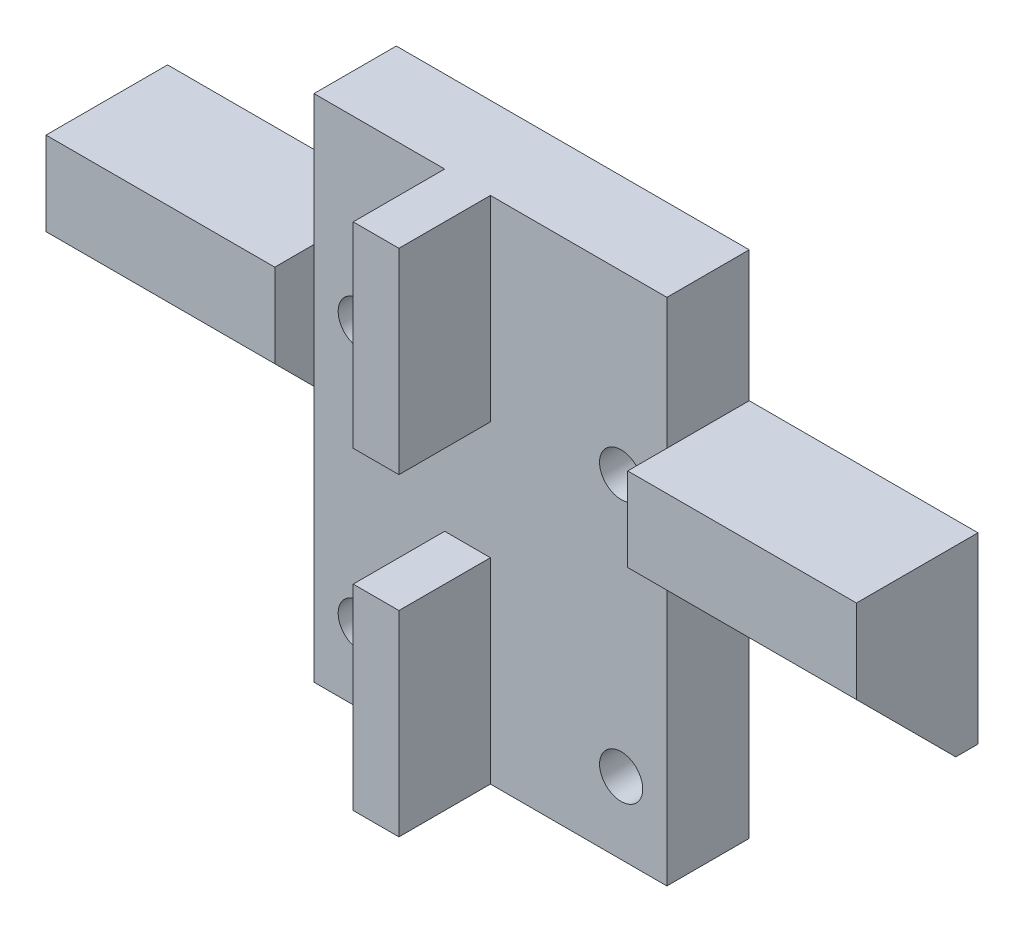
ISO-10303-21;
HEADER;
FILE_DESCRIPTION(('STEP AP214'),'2;1');
FILE_NAME('part.step','',(''),(''),'','','');
FILE_SCHEMA(('AUTOMOTIVE_DESIGN { 1 0 10303 214 1 1 1 1 }'));
ENDSEC;
DATA;
#1=APPLICATION_CONTEXT('core data for automotive mechanical design processes');
#2=APPLICATION_PROTOCOL_DEFINITION('international standard','automotive_design',2000,#1);
#3=PRODUCT_CONTEXT('',#1,'mechanical');
#4=PRODUCT('Part','Part','',(#3));
#5=PRODUCT_RELATED_PRODUCT_CATEGORY('part','',(#4));
#6=PRODUCT_DEFINITION_FORMATION('','',#4);
#7=PRODUCT_DEFINITION_CONTEXT('part definition',#1,'design');
#8=PRODUCT_DEFINITION('design','',#6,#7);
#9=PRODUCT_DEFINITION_SHAPE('','',#8);
#10=(LENGTH_UNIT() NAMED_UNIT(*) SI_UNIT(.MILLI.,.METRE.));
#11=(NAMED_UNIT(*) PLANE_ANGLE_UNIT() SI_UNIT($,.RADIAN.));
#12=(NAMED_UNIT(*) SI_UNIT($,.STERADIAN.) SOLID_ANGLE_UNIT());
#13=UNCERTAINTY_MEASURE_WITH_UNIT(LENGTH_MEASURE(1.E-05),#10,'distance_accuracy_value','');
#14=(GEOMETRIC_REPRESENTATION_CONTEXT(3) GLOBAL_UNCERTAINTY_ASSIGNED_CONTEXT((#13)) GLOBAL_UNIT_ASSIGNED_CONTEXT((#10,
#11,#12)) REPRESENTATION_CONTEXT('',''));
#15=CARTESIAN_POINT('',(0.,0.,0.));
#16=DIRECTION('',(0.,0.,1.));
#17=DIRECTION('',(1.,0.,0.));
#18=AXIS2_PLACEMENT_3D('',#15,#16,#17);
#19=CARTESIAN_POINT('',(-31.,13.5,13.3));
#20=DIRECTION('',(0.,-1.,0.));
#21=DIRECTION('',(0.,0.,-1.));
#22=AXIS2_PLACEMENT_3D('',#19,#20,#21);
#23=PLANE('',#22);
#24=DIRECTION('',(-1.,0.,0.));
#25=VECTOR('',#24,1.);
#26=CARTESIAN_POINT('',(-31.,13.5,9.3));
#27=LINE('',#26,#25);
#28=CARTESIAN_POINT('',(-13.5,13.5,9.3));
#29=VERTEX_POINT('',#28);
#30=CARTESIAN_POINT('',(-31.,13.5,9.3));
#31=VERTEX_POINT('',#30);
#32=EDGE_CURVE('E337',#29,#31,#27,.T.);
#33=ORIENTED_EDGE('',*,*,#32,.F.);
#34=DIRECTION('',(0.,0.,-1.));
#35=VECTOR('',#34,1.);
#36=CARTESIAN_POINT('',(-13.5,13.5,13.3));
#37=LINE('',#36,#35);
#38=CARTESIAN_POINT('',(-13.5,13.5,6.3));
#39=VERTEX_POINT('',#38);
#40=EDGE_CURVE('E11',#29,#39,#37,.T.);
#41=ORIENTED_EDGE('',*,*,#40,.T.);
#42=CARTESIAN_POINT('',(-13.5,13.5,0.));
#43=VERTEX_POINT('',#42);
#44=EDGE_CURVE('E43',#39,#43,#37,.T.);
#45=ORIENTED_EDGE('',*,*,#44,.T.);
#46=DIRECTION('',(-1.,0.,0.));
#47=VECTOR('',#46,1.);
#48=CARTESIAN_POINT('',(-31.,13.5,0.));
#49=LINE('',#48,#47);
#50=CARTESIAN_POINT('',(-31.,13.5,0.));
#51=VERTEX_POINT('',#50);
#52=EDGE_CURVE('E270',#43,#51,#49,.T.);
#53=ORIENTED_EDGE('',*,*,#52,.T.);
#54=DIRECTION('',(0.,0.,-1.));
#55=VECTOR('',#54,1.);
#56=CARTESIAN_POINT('',(-31.,13.5,13.3));
#57=LINE('',#56,#55);
#58=EDGE_CURVE('E218',#31,#51,#57,.T.);
#59=ORIENTED_EDGE('',*,*,#58,.F.);
#60=EDGE_LOOP('',(#33,#41,#45,#53,#59));
#61=FACE_BOUND('',#60,.T.);
#62=ADVANCED_FACE('F34',(#61),#23,.F.);
#63=CARTESIAN_POINT('',(-31.,-0.5,13.3));
#64=DIRECTION('',(1.,0.,0.));
#65=DIRECTION('',(0.,1.,0.));
#66=AXIS2_PLACEMENT_3D('',#63,#64,#65);
#67=PLANE('',#66);
#68=DIRECTION('',(0.,0.,-1.));
#69=VECTOR('',#68,1.);
#70=CARTESIAN_POINT('',(-31.,-0.5,13.3));
#71=LINE('',#70,#69);
#72=CARTESIAN_POINT('',(-31.,-0.500000000000015,1.7));
#73=VERTEX_POINT('',#72);
#74=CARTESIAN_POINT('',(-31.,-0.5,0.));
#75=VERTEX_POINT('',#74);
#76=EDGE_CURVE('E210',#73,#75,#71,.T.);
#77=ORIENTED_EDGE('',*,*,#76,.F.);
#78=DIRECTION('',(0.,-0.707106781186548,-0.707106781186547));
#79=VECTOR('',#78,1.);
#80=CARTESIAN_POINT('',(-31.,-0.500000000000015,1.7));
#81=LINE('',#80,#79);
#82=CARTESIAN_POINT('',(-31.,7.09999999999999,9.3));
#83=VERTEX_POINT('',#82);
#84=EDGE_CURVE('E195',#83,#73,#81,.T.);
#85=ORIENTED_EDGE('',*,*,#84,.F.);
#86=DIRECTION('',(0.,-1.,0.));
#87=VECTOR('',#86,1.);
#88=CARTESIAN_POINT('',(-31.,13.5,9.3));
#89=LINE('',#88,#87);
#90=EDGE_CURVE('E376',#31,#83,#89,.T.);
#91=ORIENTED_EDGE('',*,*,#90,.F.);
#92=ORIENTED_EDGE('',*,*,#58,.T.);
#93=DIRECTION('',(0.,-1.,0.));
#94=VECTOR('',#93,1.);
#95=CARTESIAN_POINT('',(-31.,-0.5,0.));
#96=LINE('',#95,#94);
#97=EDGE_CURVE('E216',#51,#75,#96,.T.);
#98=ORIENTED_EDGE('',*,*,#97,.T.);
#99=EDGE_LOOP('',(#77,#85,#91,#92,#98));
#100=FACE_BOUND('',#99,.T.);
#101=ADVANCED_FACE('F214',(#100),#67,.F.);
#102=CARTESIAN_POINT('',(-13.5,-0.500000000000006,13.3));
#103=DIRECTION('',(0.,1.,0.));
#104=DIRECTION('',(-1.,0.,0.));
#105=AXIS2_PLACEMENT_3D('',#102,#103,#104);
#106=PLANE('',#105);
#107=DIRECTION('',(0.,0.,-1.));
#108=VECTOR('',#107,1.);
#109=CARTESIAN_POINT('',(-13.5,-0.500000000000006,13.3));
#110=LINE('',#109,#108);
#111=CARTESIAN_POINT('',(-13.5,-0.500000000000011,1.7));
#112=VERTEX_POINT('',#111);
#113=CARTESIAN_POINT('',(-13.5,-0.500000000000006,0.));
#114=VERTEX_POINT('',#113);
#115=EDGE_CURVE('E212',#112,#114,#110,.T.);
#116=ORIENTED_EDGE('',*,*,#115,.F.);
#117=DIRECTION('',(-1.,0.,0.));
#118=VECTOR('',#117,1.);
#119=CARTESIAN_POINT('',(-2.75197692596447,-0.500000000000008,1.7));
#120=LINE('',#119,#118);
#121=EDGE_CURVE('E198',#112,#73,#120,.T.);
#122=ORIENTED_EDGE('',*,*,#121,.T.);
#123=ORIENTED_EDGE('',*,*,#76,.T.);
#124=DIRECTION('',(1.,0.,0.));
#125=VECTOR('',#124,1.);
#126=CARTESIAN_POINT('',(-13.5,-0.500000000000006,0.));
#127=LINE('',#126,#125);
#128=EDGE_CURVE('E267',#75,#114,#127,.T.);
#129=ORIENTED_EDGE('',*,*,#128,.T.);
#130=EDGE_LOOP('',(#116,#122,#123,#129));
#131=FACE_BOUND('',#130,.T.);
#132=ADVANCED_FACE('F208',(#131),#106,.F.);
#133=CARTESIAN_POINT('',(31.,-0.5,13.3));
#134=DIRECTION('',(0.,1.,0.));
#135=DIRECTION('',(-1.,0.,0.));
#136=AXIS2_PLACEMENT_3D('',#133,#134,#135);
#137=PLANE('',#136);
#138=DIRECTION('',(0.,0.,-1.));
#139=VECTOR('',#138,1.);
#140=CARTESIAN_POINT('',(31.,-0.5,13.3));
#141=LINE('',#140,#139);
#142=CARTESIAN_POINT('',(31.,-0.500000000000008,1.7));
#143=VERTEX_POINT('',#142);
#144=CARTESIAN_POINT('',(31.,-0.5,0.));
#145=VERTEX_POINT('',#144);
#146=EDGE_CURVE('E229',#143,#145,#141,.T.);
#147=ORIENTED_EDGE('',*,*,#146,.F.);
#148=DIRECTION('',(1.,0.,0.));
#149=VECTOR('',#148,1.);
#150=CARTESIAN_POINT('',(2.75197692596447,-0.500000000000001,1.7));
#151=LINE('',#150,#149);
#152=CARTESIAN_POINT('',(13.5,-0.500000000000004,1.7));
#153=VERTEX_POINT('',#152);
#154=EDGE_CURVE('E387',#153,#143,#151,.T.);
#155=ORIENTED_EDGE('',*,*,#154,.F.);
#156=DIRECTION('',(0.,0.,-1.));
#157=VECTOR('',#156,1.);
#158=CARTESIAN_POINT('',(13.5,-0.500000000000006,13.3));
#159=LINE('',#158,#157);
#160=CARTESIAN_POINT('',(13.5,-0.500000000000006,0.));
#161=VERTEX_POINT('',#160);
#162=EDGE_CURVE('E227',#153,#161,#159,.T.);
#163=ORIENTED_EDGE('',*,*,#162,.T.);
#164=DIRECTION('',(1.,0.,0.));
#165=VECTOR('',#164,1.);
#166=CARTESIAN_POINT('',(31.,-0.5,0.));
#167=LINE('',#166,#165);
#168=EDGE_CURVE('E255',#161,#145,#167,.T.);
#169=ORIENTED_EDGE('',*,*,#168,.T.);
#170=EDGE_LOOP('',(#147,#155,#163,#169));
#171=FACE_BOUND('',#170,.T.);
#172=ADVANCED_FACE('F438',(#171),#137,.F.);
#173=CARTESIAN_POINT('',(31.,13.5,13.3));
#174=DIRECTION('',(-1.,0.,0.));
#175=DIRECTION('',(0.,-1.,0.));
#176=AXIS2_PLACEMENT_3D('',#173,#174,#175);
#177=PLANE('',#176);
#178=DIRECTION('',(0.,1.,0.));
#179=VECTOR('',#178,1.);
#180=CARTESIAN_POINT('',(31.,13.5,9.3));
#181=LINE('',#180,#179);
#182=CARTESIAN_POINT('',(31.,7.1,9.3));
#183=VERTEX_POINT('',#182);
#184=CARTESIAN_POINT('',(31.,13.5,9.3));
#185=VERTEX_POINT('',#184);
#186=EDGE_CURVE('E377',#183,#185,#181,.T.);
#187=ORIENTED_EDGE('',*,*,#186,.F.);
#188=DIRECTION('',(0.,0.707106781186548,0.707106781186547));
#189=VECTOR('',#188,1.);
#190=CARTESIAN_POINT('',(31.,7.1,9.3));
#191=LINE('',#190,#189);
#192=EDGE_CURVE('E58',#143,#183,#191,.T.);
#193=ORIENTED_EDGE('',*,*,#192,.F.);
#194=ORIENTED_EDGE('',*,*,#146,.T.);
#195=DIRECTION('',(0.,1.,0.));
#196=VECTOR('',#195,1.);
#197=CARTESIAN_POINT('',(31.,13.5,0.));
#198=LINE('',#197,#196);
#199=CARTESIAN_POINT('',(31.,13.5,0.));
#200=VERTEX_POINT('',#199);
#201=EDGE_CURVE('E252',#145,#200,#198,.T.);
#202=ORIENTED_EDGE('',*,*,#201,.T.);
#203=DIRECTION('',(0.,0.,-1.));
#204=VECTOR('',#203,1.);
#205=CARTESIAN_POINT('',(31.,13.5,13.3));
#206=LINE('',#205,#204);
#207=EDGE_CURVE('E231',#185,#200,#206,.T.);
#208=ORIENTED_EDGE('',*,*,#207,.F.);
#209=EDGE_LOOP('',(#187,#193,#194,#202,#208));
#210=FACE_BOUND('',#209,.T.);
#211=ADVANCED_FACE('F454',(#210),#177,.F.);
#212=CARTESIAN_POINT('',(13.5,13.5,13.3));
#213=DIRECTION('',(0.,-1.,0.));
#214=DIRECTION('',(0.,0.,-1.));
#215=AXIS2_PLACEMENT_3D('',#212,#213,#214);
#216=PLANE('',#215);
#217=DIRECTION('',(-1.,0.,0.));
#218=VECTOR('',#217,1.);
#219=CARTESIAN_POINT('',(13.5,13.5,9.3));
#220=LINE('',#219,#218);
#221=CARTESIAN_POINT('',(13.5,13.5,9.3));
#222=VERTEX_POINT('',#221);
#223=EDGE_CURVE('E374',#185,#222,#220,.T.);
#224=ORIENTED_EDGE('',*,*,#223,.F.);
#225=ORIENTED_EDGE('',*,*,#207,.T.);
#226=DIRECTION('',(-1.,0.,0.));
#227=VECTOR('',#226,1.);
#228=CARTESIAN_POINT('',(13.5,13.5,0.));
#229=LINE('',#228,#227);
#230=CARTESIAN_POINT('',(13.5,13.5,0.));
#231=VERTEX_POINT('',#230);
#232=EDGE_CURVE('E249',#200,#231,#229,.T.);
#233=ORIENTED_EDGE('',*,*,#232,.T.);
#234=DIRECTION('',(0.,0.,-1.));
#235=VECTOR('',#234,1.);
#236=CARTESIAN_POINT('',(13.5,13.5,13.3));
#237=LINE('',#236,#235);
#238=CARTESIAN_POINT('',(13.5,13.5,6.3));
#239=VERTEX_POINT('',#238);
#240=EDGE_CURVE('E236',#239,#231,#237,.T.);
#241=ORIENTED_EDGE('',*,*,#240,.F.);
#242=EDGE_CURVE('E233',#222,#239,#237,.T.);
#243=ORIENTED_EDGE('',*,*,#242,.F.);
#244=EDGE_LOOP('',(#224,#225,#233,#241,#243));
#245=FACE_BOUND('',#244,.T.);
#246=ADVANCED_FACE('F458',(#245),#216,.F.);
#247=CARTESIAN_POINT('',(13.5,23.5,6.3));
#248=DIRECTION('',(1.,0.,0.));
#249=DIRECTION('',(0.,1.,0.));
#250=AXIS2_PLACEMENT_3D('',#247,#248,#249);
#251=PLANE('',#250);
#252=DIRECTION('',(0.,1.,0.));
#253=VECTOR('',#252,1.);
#254=CARTESIAN_POINT('',(13.5,23.5,6.3));
#255=LINE('',#254,#253);
#256=CARTESIAN_POINT('',(13.5,4.1,6.3));
#257=VERTEX_POINT('',#256);
#258=EDGE_CURVE('E341',#257,#239,#255,.T.);
#259=ORIENTED_EDGE('',*,*,#258,.F.);
#260=DIRECTION('',(0.,-0.707106781186548,-0.707106781186547));
#261=VECTOR('',#260,1.);
#262=CARTESIAN_POINT('',(13.5,7.1,9.3));
#263=LINE('',#262,#261);
#264=CARTESIAN_POINT('',(13.5,7.1,9.3));
#265=VERTEX_POINT('',#264);
#266=EDGE_CURVE('E382',#265,#257,#263,.T.);
#267=ORIENTED_EDGE('',*,*,#266,.F.);
#268=DIRECTION('',(0.,-1.,0.));
#269=VECTOR('',#268,1.);
#270=CARTESIAN_POINT('',(13.5,13.5,9.3));
#271=LINE('',#270,#269);
#272=EDGE_CURVE('E379',#222,#265,#271,.T.);
#273=ORIENTED_EDGE('',*,*,#272,.F.);
#274=ORIENTED_EDGE('',*,*,#242,.T.);
#275=EDGE_LOOP('',(#259,#267,#273,#274));
#276=FACE_BOUND('',#275,.T.);
#277=ADVANCED_FACE('F462',(#276),#251,.F.);
#278=CARTESIAN_POINT('',(-13.5,-15.5,6.3));
#279=DIRECTION('',(-1.,0.,0.));
#280=DIRECTION('',(0.,-1.,0.));
#281=AXIS2_PLACEMENT_3D('',#278,#279,#280);
#282=PLANE('',#281);
#283=DIRECTION('',(0.,1.,0.));
#284=VECTOR('',#283,1.);
#285=CARTESIAN_POINT('',(-13.5,13.5,9.3));
#286=LINE('',#285,#284);
#287=CARTESIAN_POINT('',(-13.5,7.1,9.3));
#288=VERTEX_POINT('',#287);
#289=EDGE_CURVE('E384',#288,#29,#286,.T.);
#290=ORIENTED_EDGE('',*,*,#289,.F.);
#291=DIRECTION('',(0.,0.707106781186548,0.707106781186547));
#292=VECTOR('',#291,1.);
#293=CARTESIAN_POINT('',(-13.5,-0.50000000000001,1.7));
#294=LINE('',#293,#292);
#295=CARTESIAN_POINT('',(-13.5,4.09999999999999,6.3));
#296=VERTEX_POINT('',#295);
#297=EDGE_CURVE('E50',#296,#288,#294,.T.);
#298=ORIENTED_EDGE('',*,*,#297,.F.);
#299=DIRECTION('',(0.,-1.,0.));
#300=VECTOR('',#299,1.);
#301=CARTESIAN_POINT('',(-13.5,-15.5,6.3));
#302=LINE('',#301,#300);
#303=EDGE_CURVE('E362',#39,#296,#302,.T.);
#304=ORIENTED_EDGE('',*,*,#303,.F.);
#305=ORIENTED_EDGE('',*,*,#40,.F.);
#306=EDGE_LOOP('',(#290,#298,#304,#305));
#307=FACE_BOUND('',#306,.T.);
#308=ADVANCED_FACE('F511',(#307),#282,.F.);
#309=CARTESIAN_POINT('',(0.,0.,13.3));
#310=DIRECTION('',(0.,0.,-1.));
#311=DIRECTION('',(-1.,0.,0.));
#312=AXIS2_PLACEMENT_3D('',#309,#310,#311);
#313=PLANE('',#312);
#314=DIRECTION('',(1.,0.,0.));
#315=VECTOR('',#314,1.);
#316=CARTESIAN_POINT('',(13.5,-15.5,13.3));
#317=LINE('',#316,#315);
#318=CARTESIAN_POINT('',(-3.5,-15.5,13.3));
#319=VERTEX_POINT('',#318);
#320=CARTESIAN_POINT('',(0.,-15.5,13.3));
#321=VERTEX_POINT('',#320);
#322=EDGE_CURVE('E245',#319,#321,#317,.T.);
#323=ORIENTED_EDGE('',*,*,#322,.T.);
#324=DIRECTION('',(0.,-1.,0.));
#325=VECTOR('',#324,1.);
#326=CARTESIAN_POINT('',(0.,-15.5,13.3));
#327=LINE('',#326,#325);
#328=CARTESIAN_POINT('',(0.,-0.500000000000006,13.3));
#329=VERTEX_POINT('',#328);
#330=EDGE_CURVE('E320',#329,#321,#327,.T.);
#331=ORIENTED_EDGE('',*,*,#330,.F.);
#332=DIRECTION('',(1.,0.,0.));
#333=VECTOR('',#332,1.);
#334=CARTESIAN_POINT('',(0.,-0.500000000000006,13.3));
#335=LINE('',#334,#333);
#336=CARTESIAN_POINT('',(-3.5,-0.500000000000006,13.3));
#337=VERTEX_POINT('',#336);
#338=EDGE_CURVE('E323',#337,#329,#335,.T.);
#339=ORIENTED_EDGE('',*,*,#338,.F.);
#340=DIRECTION('',(0.,1.,0.));
#341=VECTOR('',#340,1.);
#342=CARTESIAN_POINT('',(-3.5,-0.500000000000006,13.3));
#343=LINE('',#342,#341);
#344=EDGE_CURVE('E326',#319,#337,#343,.T.);
#345=ORIENTED_EDGE('',*,*,#344,.F.);
#346=EDGE_LOOP('',(#323,#331,#339,#345));
#347=FACE_BOUND('',#346,.T.);
#348=ADVANCED_FACE('F479',(#347),#313,.F.);
#349=DIRECTION('',(-1.,0.,0.));
#350=VECTOR('',#349,1.);
#351=CARTESIAN_POINT('',(-3.5,8.5,13.3));
#352=LINE('',#351,#350);
#353=CARTESIAN_POINT('',(0.,8.5,13.3));
#354=VERTEX_POINT('',#353);
#355=CARTESIAN_POINT('',(-3.5,8.5,13.3));
#356=VERTEX_POINT('',#355);
#357=EDGE_CURVE('E331',#354,#356,#352,.T.);
#358=ORIENTED_EDGE('',*,*,#357,.F.);
#359=DIRECTION('',(0.,-1.,0.));
#360=VECTOR('',#359,1.);
#361=CARTESIAN_POINT('',(0.,8.5,13.3));
#362=LINE('',#361,#360);
#363=CARTESIAN_POINT('',(0.,23.5,13.3));
#364=VERTEX_POINT('',#363);
#365=EDGE_CURVE('E334',#364,#354,#362,.T.);
#366=ORIENTED_EDGE('',*,*,#365,.F.);
#367=DIRECTION('',(-1.,0.,0.));
#368=VECTOR('',#367,1.);
#369=CARTESIAN_POINT('',(-13.5,23.5,13.3));
#370=LINE('',#369,#368);
#371=CARTESIAN_POINT('',(-3.5,23.5,13.3));
#372=VERTEX_POINT('',#371);
#373=EDGE_CURVE('E241',#364,#372,#370,.T.);
#374=ORIENTED_EDGE('',*,*,#373,.T.);
#375=DIRECTION('',(0.,1.,0.));
#376=VECTOR('',#375,1.);
#377=CARTESIAN_POINT('',(-3.5,23.5,13.3));
#378=LINE('',#377,#376);
#379=EDGE_CURVE('E329',#356,#372,#378,.T.);
#380=ORIENTED_EDGE('',*,*,#379,.F.);
#381=EDGE_LOOP('',(#358,#366,#374,#380));
#382=FACE_BOUND('',#381,.T.);
#383=ADVANCED_FACE('F475',(#382),#313,.F.);
#384=CARTESIAN_POINT('',(0.,0.,0.));
#385=DIRECTION('',(0.,0.,-1.));
#386=DIRECTION('',(-1.,0.,0.));
#387=AXIS2_PLACEMENT_3D('',#384,#385,#386);
#388=PLANE('',#387);
#389=CARTESIAN_POINT('',(10.,-10.,0.));
#390=DIRECTION('',(0.,0.,1.));
#391=DIRECTION('',(1.,0.,0.));
#392=AXIS2_PLACEMENT_3D('',#389,#390,#391);
#393=CIRCLE('',#392,1.65);
#394=CARTESIAN_POINT('',(11.65,-10.,0.));
#395=VERTEX_POINT('',#394);
#396=EDGE_CURVE('E286',#395,#395,#393,.T.);
#397=ORIENTED_EDGE('',*,*,#396,.T.);
#398=EDGE_LOOP('',(#397));
#399=FACE_BOUND('',#398,.T.);
#400=CARTESIAN_POINT('',(-10.,10.,0.));
#401=DIRECTION('',(0.,0.,1.));
#402=DIRECTION('',(1.,0.,0.));
#403=AXIS2_PLACEMENT_3D('',#400,#401,#402);
#404=CIRCLE('',#403,1.65);
#405=CARTESIAN_POINT('',(-8.35,10.,0.));
#406=VERTEX_POINT('',#405);
#407=EDGE_CURVE('E276',#406,#406,#404,.T.);
#408=ORIENTED_EDGE('',*,*,#407,.T.);
#409=EDGE_LOOP('',(#408));
#410=FACE_BOUND('',#409,.T.);
#411=DIRECTION('',(0.,-1.,0.));
#412=VECTOR('',#411,1.);
#413=CARTESIAN_POINT('',(-13.5,13.5,0.));
#414=LINE('',#413,#412);
#415=CARTESIAN_POINT('',(-13.5,23.5,0.));
#416=VERTEX_POINT('',#415);
#417=EDGE_CURVE('E273',#416,#43,#414,.T.);
#418=ORIENTED_EDGE('',*,*,#417,.F.);
#419=DIRECTION('',(-1.,0.,0.));
#420=VECTOR('',#419,1.);
#421=CARTESIAN_POINT('',(-13.5,23.5,0.));
#422=LINE('',#421,#420);
#423=CARTESIAN_POINT('',(13.5,23.5,0.));
#424=VERTEX_POINT('',#423);
#425=EDGE_CURVE('E242',#424,#416,#422,.T.);
#426=ORIENTED_EDGE('',*,*,#425,.F.);
#427=DIRECTION('',(0.,1.,0.));
#428=VECTOR('',#427,1.);
#429=CARTESIAN_POINT('',(13.5,23.5,0.));
#430=LINE('',#429,#428);
#431=EDGE_CURVE('E246',#231,#424,#430,.T.);
#432=ORIENTED_EDGE('',*,*,#431,.F.);
#433=ORIENTED_EDGE('',*,*,#232,.F.);
#434=ORIENTED_EDGE('',*,*,#201,.F.);
#435=ORIENTED_EDGE('',*,*,#168,.F.);
#436=DIRECTION('',(0.,1.,0.));
#437=VECTOR('',#436,1.);
#438=CARTESIAN_POINT('',(13.5,-0.500000000000006,0.));
#439=LINE('',#438,#437);
#440=CARTESIAN_POINT('',(13.5,-15.5,0.));
#441=VERTEX_POINT('',#440);
#442=EDGE_CURVE('E258',#441,#161,#439,.T.);
#443=ORIENTED_EDGE('',*,*,#442,.F.);
#444=DIRECTION('',(1.,0.,0.));
#445=VECTOR('',#444,1.);
#446=CARTESIAN_POINT('',(13.5,-15.5,0.));
#447=LINE('',#446,#445);
#448=CARTESIAN_POINT('',(-13.5,-15.5,0.));
#449=VERTEX_POINT('',#448);
#450=EDGE_CURVE('E261',#449,#441,#447,.T.);
#451=ORIENTED_EDGE('',*,*,#450,.F.);
#452=DIRECTION('',(0.,-1.,0.));
#453=VECTOR('',#452,1.);
#454=CARTESIAN_POINT('',(-13.5,-15.5,0.));
#455=LINE('',#454,#453);
#456=EDGE_CURVE('E264',#114,#449,#455,.T.);
#457=ORIENTED_EDGE('',*,*,#456,.F.);
#458=ORIENTED_EDGE('',*,*,#128,.F.);
#459=ORIENTED_EDGE('',*,*,#97,.F.);
#460=ORIENTED_EDGE('',*,*,#52,.F.);
#461=EDGE_LOOP('',(#418,#426,#432,#433,#434,#435,#443,#451,#457,#458,#459,#460));
#462=FACE_BOUND('',#461,.T.);
#463=CARTESIAN_POINT('',(10.,10.,0.));
#464=DIRECTION('',(0.,0.,1.));
#465=DIRECTION('',(1.,0.,0.));
#466=AXIS2_PLACEMENT_3D('',#463,#464,#465);
#467=CIRCLE('',#466,1.65);
#468=CARTESIAN_POINT('',(11.65,10.,0.));
#469=VERTEX_POINT('',#468);
#470=EDGE_CURVE('E283',#469,#469,#467,.T.);
#471=ORIENTED_EDGE('',*,*,#470,.T.);
#472=EDGE_LOOP('',(#471));
#473=FACE_BOUND('',#472,.T.);
#474=CARTESIAN_POINT('',(-10.,-10.,0.));
#475=DIRECTION('',(0.,0.,1.));
#476=DIRECTION('',(1.,0.,0.));
#477=AXIS2_PLACEMENT_3D('',#474,#475,#476);
#478=CIRCLE('',#477,1.65);
#479=CARTESIAN_POINT('',(-8.35,-10.,0.));
#480=VERTEX_POINT('',#479);
#481=EDGE_CURVE('E289',#480,#480,#478,.T.);
#482=ORIENTED_EDGE('',*,*,#481,.T.);
#483=EDGE_LOOP('',(#482));
#484=FACE_BOUND('',#483,.T.);
#485=ADVANCED_FACE('F472',(#399,#410,#462,#473,#484),#388,.T.);
#486=CARTESIAN_POINT('',(-13.5,13.5,13.3));
#487=DIRECTION('',(1.,0.,0.));
#488=DIRECTION('',(0.,1.,0.));
#489=AXIS2_PLACEMENT_3D('',#486,#487,#488);
#490=PLANE('',#489);
#491=ORIENTED_EDGE('',*,*,#44,.F.);
#492=CARTESIAN_POINT('',(-13.5,23.5,6.3));
#493=VERTEX_POINT('',#492);
#494=EDGE_CURVE('E359',#493,#39,#302,.T.);
#495=ORIENTED_EDGE('',*,*,#494,.F.);
#496=DIRECTION('',(0.,0.,-1.));
#497=VECTOR('',#496,1.);
#498=CARTESIAN_POINT('',(-13.5,23.5,13.3));
#499=LINE('',#498,#497);
#500=EDGE_CURVE('E239',#493,#416,#499,.T.);
#501=ORIENTED_EDGE('',*,*,#500,.T.);
#502=ORIENTED_EDGE('',*,*,#417,.T.);
#503=EDGE_LOOP('',(#491,#495,#501,#502));
#504=FACE_BOUND('',#503,.T.);
#505=ADVANCED_FACE('F36',(#504),#490,.F.);
#506=CARTESIAN_POINT('',(-13.5,-15.5,13.3));
#507=DIRECTION('',(1.,0.,0.));
#508=DIRECTION('',(0.,1.,0.));
#509=AXIS2_PLACEMENT_3D('',#506,#507,#508);
#510=PLANE('',#509);
#511=DIRECTION('',(0.,0.,-1.));
#512=VECTOR('',#511,1.);
#513=CARTESIAN_POINT('',(-13.5,-15.5,13.3));
#514=LINE('',#513,#512);
#515=CARTESIAN_POINT('',(-13.5,-15.5,6.3));
#516=VERTEX_POINT('',#515);
#517=EDGE_CURVE('E221',#516,#449,#514,.T.);
#518=ORIENTED_EDGE('',*,*,#517,.F.);
#519=EDGE_CURVE('E363',#296,#516,#302,.T.);
#520=ORIENTED_EDGE('',*,*,#519,.F.);
#521=EDGE_CURVE('E393',#112,#296,#294,.T.);
#522=ORIENTED_EDGE('',*,*,#521,.F.);
#523=ORIENTED_EDGE('',*,*,#115,.T.);
#524=ORIENTED_EDGE('',*,*,#456,.T.);
#525=EDGE_LOOP('',(#518,#520,#522,#523,#524));
#526=FACE_BOUND('',#525,.T.);
#527=ADVANCED_FACE('F439',(#526),#510,.F.);
#528=CARTESIAN_POINT('',(13.5,-15.5,13.3));
#529=DIRECTION('',(0.,1.,0.));
#530=DIRECTION('',(0.,0.,1.));
#531=AXIS2_PLACEMENT_3D('',#528,#529,#530);
#532=PLANE('',#531);
#533=DIRECTION('',(1.,0.,0.));
#534=VECTOR('',#533,1.);
#535=CARTESIAN_POINT('',(13.5,-15.5,6.3));
#536=LINE('',#535,#534);
#537=CARTESIAN_POINT('',(0.,-15.5,6.3));
#538=VERTEX_POINT('',#537);
#539=CARTESIAN_POINT('',(13.5,-15.5,6.3));
#540=VERTEX_POINT('',#539);
#541=EDGE_CURVE('E344',#538,#540,#536,.T.);
#542=ORIENTED_EDGE('',*,*,#541,.F.);
#543=DIRECTION('',(0.,0.,1.));
#544=VECTOR('',#543,1.);
#545=CARTESIAN_POINT('',(0.,-15.5,6.3));
#546=LINE('',#545,#544);
#547=EDGE_CURVE('E315',#538,#321,#546,.T.);
#548=ORIENTED_EDGE('',*,*,#547,.T.);
#549=ORIENTED_EDGE('',*,*,#322,.F.);
#550=DIRECTION('',(0.,0.,1.));
#551=VECTOR('',#550,1.);
#552=CARTESIAN_POINT('',(-3.5,-15.5,6.3));
#553=LINE('',#552,#551);
#554=CARTESIAN_POINT('',(-3.5,-15.5,6.3));
#555=VERTEX_POINT('',#554);
#556=EDGE_CURVE('E309',#555,#319,#553,.T.);
#557=ORIENTED_EDGE('',*,*,#556,.F.);
#558=DIRECTION('',(1.,0.,0.));
#559=VECTOR('',#558,1.);
#560=CARTESIAN_POINT('',(-3.5,-15.5,6.3));
#561=LINE('',#560,#559);
#562=EDGE_CURVE('E356',#516,#555,#561,.T.);
#563=ORIENTED_EDGE('',*,*,#562,.F.);
#564=ORIENTED_EDGE('',*,*,#517,.T.);
#565=ORIENTED_EDGE('',*,*,#450,.T.);
#566=DIRECTION('',(0.,0.,-1.));
#567=VECTOR('',#566,1.);
#568=CARTESIAN_POINT('',(13.5,-15.5,13.3));
#569=LINE('',#568,#567);
#570=EDGE_CURVE('E225',#540,#441,#569,.T.);
#571=ORIENTED_EDGE('',*,*,#570,.F.);
#572=EDGE_LOOP('',(#542,#548,#549,#557,#563,#564,#565,#571));
#573=FACE_BOUND('',#572,.T.);
#574=ADVANCED_FACE('F442',(#573),#532,.F.);
#575=CARTESIAN_POINT('',(13.5,-0.500000000000006,13.3));
#576=DIRECTION('',(-1.,0.,0.));
#577=DIRECTION('',(0.,-1.,0.));
#578=AXIS2_PLACEMENT_3D('',#575,#576,#577);
#579=PLANE('',#578);
#580=ORIENTED_EDGE('',*,*,#162,.F.);
#581=EDGE_CURVE('E391',#257,#153,#263,.T.);
#582=ORIENTED_EDGE('',*,*,#581,.F.);
#583=EDGE_CURVE('E340',#540,#257,#255,.T.);
#584=ORIENTED_EDGE('',*,*,#583,.F.);
#585=ORIENTED_EDGE('',*,*,#570,.T.);
#586=ORIENTED_EDGE('',*,*,#442,.T.);
#587=EDGE_LOOP('',(#580,#582,#584,#585,#586));
#588=FACE_BOUND('',#587,.T.);
#589=ADVANCED_FACE('F446',(#588),#579,.F.);
#590=CARTESIAN_POINT('',(13.5,23.5,13.3));
#591=DIRECTION('',(-1.,0.,0.));
#592=DIRECTION('',(0.,-1.,0.));
#593=AXIS2_PLACEMENT_3D('',#590,#591,#592);
#594=PLANE('',#593);
#595=DIRECTION('',(0.,0.,-1.));
#596=VECTOR('',#595,1.);
#597=CARTESIAN_POINT('',(13.5,23.5,13.3));
#598=LINE('',#597,#596);
#599=CARTESIAN_POINT('',(13.5,23.5,6.3));
#600=VERTEX_POINT('',#599);
#601=EDGE_CURVE('E237',#600,#424,#598,.T.);
#602=ORIENTED_EDGE('',*,*,#601,.F.);
#603=EDGE_CURVE('E343',#239,#600,#255,.T.);
#604=ORIENTED_EDGE('',*,*,#603,.F.);
#605=ORIENTED_EDGE('',*,*,#240,.T.);
#606=ORIENTED_EDGE('',*,*,#431,.T.);
#607=EDGE_LOOP('',(#602,#604,#605,#606));
#608=FACE_BOUND('',#607,.T.);
#609=ADVANCED_FACE('F450',(#608),#594,.F.);
#610=CARTESIAN_POINT('',(-13.5,23.5,13.3));
#611=DIRECTION('',(0.,-1.,0.));
#612=DIRECTION('',(0.,0.,-1.));
#613=AXIS2_PLACEMENT_3D('',#610,#611,#612);
#614=PLANE('',#613);
#615=DIRECTION('',(-1.,0.,0.));
#616=VECTOR('',#615,1.);
#617=CARTESIAN_POINT('',(-13.5,23.5,6.3));
#618=LINE('',#617,#616);
#619=CARTESIAN_POINT('',(-3.5,23.5,6.3));
#620=VERTEX_POINT('',#619);
#621=EDGE_CURVE('E364',#620,#493,#618,.T.);
#622=ORIENTED_EDGE('',*,*,#621,.F.);
#623=DIRECTION('',(0.,0.,1.));
#624=VECTOR('',#623,1.);
#625=CARTESIAN_POINT('',(-3.5,23.5,6.3));
#626=LINE('',#625,#624);
#627=EDGE_CURVE('E306',#620,#372,#626,.T.);
#628=ORIENTED_EDGE('',*,*,#627,.T.);
#629=ORIENTED_EDGE('',*,*,#373,.F.);
#630=DIRECTION('',(0.,0.,1.));
#631=VECTOR('',#630,1.);
#632=CARTESIAN_POINT('',(0.,23.5,6.3));
#633=LINE('',#632,#631);
#634=CARTESIAN_POINT('',(0.,23.5,6.3));
#635=VERTEX_POINT('',#634);
#636=EDGE_CURVE('E318',#635,#364,#633,.T.);
#637=ORIENTED_EDGE('',*,*,#636,.F.);
#638=DIRECTION('',(-1.,0.,0.));
#639=VECTOR('',#638,1.);
#640=CARTESIAN_POINT('',(0.,23.5,6.3));
#641=LINE('',#640,#639);
#642=EDGE_CURVE('E304',#600,#635,#641,.T.);
#643=ORIENTED_EDGE('',*,*,#642,.F.);
#644=ORIENTED_EDGE('',*,*,#601,.T.);
#645=ORIENTED_EDGE('',*,*,#425,.T.);
#646=ORIENTED_EDGE('',*,*,#500,.F.);
#647=EDGE_LOOP('',(#622,#628,#629,#637,#643,#644,#645,#646));
#648=FACE_BOUND('',#647,.T.);
#649=ADVANCED_FACE('F466',(#648),#614,.F.);
#650=CARTESIAN_POINT('',(-10.,10.,13.3));
#651=DIRECTION('',(0.,0.,-1.));
#652=DIRECTION('',(-1.,0.,0.));
#653=AXIS2_PLACEMENT_3D('',#650,#651,#652);
#654=CYLINDRICAL_SURFACE('',#653,1.65);
#655=CARTESIAN_POINT('',(-10.,10.,6.3));
#656=DIRECTION('',(0.,0.,-1.));
#657=DIRECTION('',(-1.,0.,0.));
#658=AXIS2_PLACEMENT_3D('',#655,#656,#657);
#659=CIRCLE('',#658,1.65);
#660=CARTESIAN_POINT('',(-11.65,10.,6.3));
#661=VERTEX_POINT('',#660);
#662=EDGE_CURVE('E292',#661,#661,#659,.T.);
#663=ORIENTED_EDGE('',*,*,#662,.F.);
#664=EDGE_LOOP('',(#663));
#665=FACE_BOUND('',#664,.T.);
#666=ORIENTED_EDGE('',*,*,#407,.F.);
#667=EDGE_LOOP('',(#666));
#668=FACE_BOUND('',#667,.T.);
#669=ADVANCED_FACE('F470',(#665,#668),#654,.F.);
#670=CARTESIAN_POINT('',(10.,10.,13.3));
#671=DIRECTION('',(0.,0.,-1.));
#672=DIRECTION('',(-1.,0.,0.));
#673=AXIS2_PLACEMENT_3D('',#670,#671,#672);
#674=CYLINDRICAL_SURFACE('',#673,1.65);
#675=CARTESIAN_POINT('',(10.,10.,6.3));
#676=DIRECTION('',(0.,0.,-1.));
#677=DIRECTION('',(-1.,0.,0.));
#678=AXIS2_PLACEMENT_3D('',#675,#676,#677);
#679=CIRCLE('',#678,1.65);
#680=CARTESIAN_POINT('',(8.35,10.,6.3));
#681=VERTEX_POINT('',#680);
#682=EDGE_CURVE('E295',#681,#681,#679,.T.);
#683=ORIENTED_EDGE('',*,*,#682,.F.);
#684=EDGE_LOOP('',(#683));
#685=FACE_BOUND('',#684,.T.);
#686=ORIENTED_EDGE('',*,*,#470,.F.);
#687=EDGE_LOOP('',(#686));
#688=FACE_BOUND('',#687,.T.);
#689=ADVANCED_FACE('F483',(#685,#688),#674,.F.);
#690=CARTESIAN_POINT('',(10.,-10.,13.3));
#691=DIRECTION('',(0.,0.,-1.));
#692=DIRECTION('',(-1.,0.,0.));
#693=AXIS2_PLACEMENT_3D('',#690,#691,#692);
#694=CYLINDRICAL_SURFACE('',#693,1.65);
#695=CARTESIAN_POINT('',(10.,-10.,6.3));
#696=DIRECTION('',(0.,0.,-1.));
#697=DIRECTION('',(-1.,0.,0.));
#698=AXIS2_PLACEMENT_3D('',#695,#696,#697);
#699=CIRCLE('',#698,1.65);
#700=CARTESIAN_POINT('',(8.35,-10.,6.3));
#701=VERTEX_POINT('',#700);
#702=EDGE_CURVE('E298',#701,#701,#699,.T.);
#703=ORIENTED_EDGE('',*,*,#702,.F.);
#704=EDGE_LOOP('',(#703));
#705=FACE_BOUND('',#704,.T.);
#706=ORIENTED_EDGE('',*,*,#396,.F.);
#707=EDGE_LOOP('',(#706));
#708=FACE_BOUND('',#707,.T.);
#709=ADVANCED_FACE('F487',(#705,#708),#694,.F.);
#710=CARTESIAN_POINT('',(-10.,-10.,13.3));
#711=DIRECTION('',(0.,0.,-1.));
#712=DIRECTION('',(-1.,0.,0.));
#713=AXIS2_PLACEMENT_3D('',#710,#711,#712);
#714=CYLINDRICAL_SURFACE('',#713,1.65);
#715=CARTESIAN_POINT('',(-10.,-10.,6.3));
#716=DIRECTION('',(0.,0.,-1.));
#717=DIRECTION('',(-1.,0.,0.));
#718=AXIS2_PLACEMENT_3D('',#715,#716,#717);
#719=CIRCLE('',#718,1.65);
#720=CARTESIAN_POINT('',(-11.65,-10.,6.3));
#721=VERTEX_POINT('',#720);
#722=EDGE_CURVE('E38',#721,#721,#719,.T.);
#723=ORIENTED_EDGE('',*,*,#722,.F.);
#724=EDGE_LOOP('',(#723));
#725=FACE_BOUND('',#724,.T.);
#726=ORIENTED_EDGE('',*,*,#481,.F.);
#727=EDGE_LOOP('',(#726));
#728=FACE_BOUND('',#727,.T.);
#729=ADVANCED_FACE('F491',(#725,#728),#714,.F.);
#730=CARTESIAN_POINT('',(0.,8.5,6.3));
#731=DIRECTION('',(-1.,0.,0.));
#732=DIRECTION('',(0.,0.,1.));
#733=AXIS2_PLACEMENT_3D('',#730,#731,#732);
#734=PLANE('',#733);
#735=ORIENTED_EDGE('',*,*,#365,.T.);
#736=DIRECTION('',(0.,0.,1.));
#737=VECTOR('',#736,1.);
#738=CARTESIAN_POINT('',(0.,8.5,6.3));
#739=LINE('',#738,#737);
#740=CARTESIAN_POINT('',(0.,8.5,6.3));
#741=VERTEX_POINT('',#740);
#742=EDGE_CURVE('E301',#741,#354,#739,.T.);
#743=ORIENTED_EDGE('',*,*,#742,.F.);
#744=DIRECTION('',(0.,-1.,0.));
#745=VECTOR('',#744,1.);
#746=CARTESIAN_POINT('',(0.,8.5,6.3));
#747=LINE('',#746,#745);
#748=EDGE_CURVE('E322',#635,#741,#747,.T.);
#749=ORIENTED_EDGE('',*,*,#748,.F.);
#750=ORIENTED_EDGE('',*,*,#636,.T.);
#751=EDGE_LOOP('',(#735,#743,#749,#750));
#752=FACE_BOUND('',#751,.T.);
#753=ADVANCED_FACE('F495',(#752),#734,.F.);
#754=CARTESIAN_POINT('',(0.,-15.5,6.3));
#755=DIRECTION('',(-1.,0.,0.));
#756=DIRECTION('',(0.,0.,1.));
#757=AXIS2_PLACEMENT_3D('',#754,#755,#756);
#758=PLANE('',#757);
#759=ORIENTED_EDGE('',*,*,#330,.T.);
#760=ORIENTED_EDGE('',*,*,#547,.F.);
#761=DIRECTION('',(0.,-1.,0.));
#762=VECTOR('',#761,1.);
#763=CARTESIAN_POINT('',(0.,-15.5,6.3));
#764=LINE('',#763,#762);
#765=CARTESIAN_POINT('',(0.,-0.500000000000006,6.3));
#766=VERTEX_POINT('',#765);
#767=EDGE_CURVE('E347',#766,#538,#764,.T.);
#768=ORIENTED_EDGE('',*,*,#767,.F.);
#769=DIRECTION('',(0.,0.,1.));
#770=VECTOR('',#769,1.);
#771=CARTESIAN_POINT('',(0.,-0.500000000000006,6.3));
#772=LINE('',#771,#770);
#773=EDGE_CURVE('E313',#766,#329,#772,.T.);
#774=ORIENTED_EDGE('',*,*,#773,.T.);
#775=EDGE_LOOP('',(#759,#760,#768,#774));
#776=FACE_BOUND('',#775,.T.);
#777=ADVANCED_FACE('F499',(#776),#758,.F.);
#778=CARTESIAN_POINT('',(0.,-0.500000000000006,6.3));
#779=DIRECTION('',(0.,-1.,0.));
#780=DIRECTION('',(0.,0.,-1.));
#781=AXIS2_PLACEMENT_3D('',#778,#779,#780);
#782=PLANE('',#781);
#783=ORIENTED_EDGE('',*,*,#338,.T.);
#784=ORIENTED_EDGE('',*,*,#773,.F.);
#785=DIRECTION('',(1.,0.,0.));
#786=VECTOR('',#785,1.);
#787=CARTESIAN_POINT('',(0.,-0.500000000000006,6.3));
#788=LINE('',#787,#786);
#789=CARTESIAN_POINT('',(-3.5,-0.500000000000006,6.3));
#790=VERTEX_POINT('',#789);
#791=EDGE_CURVE('E350',#790,#766,#788,.T.);
#792=ORIENTED_EDGE('',*,*,#791,.F.);
#793=DIRECTION('',(0.,0.,1.));
#794=VECTOR('',#793,1.);
#795=CARTESIAN_POINT('',(-3.5,-0.500000000000006,6.3));
#796=LINE('',#795,#794);
#797=EDGE_CURVE('E311',#790,#337,#796,.T.);
#798=ORIENTED_EDGE('',*,*,#797,.T.);
#799=EDGE_LOOP('',(#783,#784,#792,#798));
#800=FACE_BOUND('',#799,.T.);
#801=ADVANCED_FACE('F517',(#800),#782,.F.);
#802=CARTESIAN_POINT('',(-3.5,-0.500000000000006,6.3));
#803=DIRECTION('',(1.,0.,0.));
#804=DIRECTION('',(0.,1.,0.));
#805=AXIS2_PLACEMENT_3D('',#802,#803,#804);
#806=PLANE('',#805);
#807=ORIENTED_EDGE('',*,*,#344,.T.);
#808=ORIENTED_EDGE('',*,*,#797,.F.);
#809=DIRECTION('',(0.,1.,0.));
#810=VECTOR('',#809,1.);
#811=CARTESIAN_POINT('',(-3.5,-0.500000000000006,6.3));
#812=LINE('',#811,#810);
#813=EDGE_CURVE('E353',#555,#790,#812,.T.);
#814=ORIENTED_EDGE('',*,*,#813,.F.);
#815=ORIENTED_EDGE('',*,*,#556,.T.);
#816=EDGE_LOOP('',(#807,#808,#814,#815));
#817=FACE_BOUND('',#816,.T.);
#818=ADVANCED_FACE('F509',(#817),#806,.F.);
#819=CARTESIAN_POINT('',(-3.5,23.5,6.3));
#820=DIRECTION('',(1.,0.,0.));
#821=DIRECTION('',(0.,1.,0.));
#822=AXIS2_PLACEMENT_3D('',#819,#820,#821);
#823=PLANE('',#822);
#824=ORIENTED_EDGE('',*,*,#379,.T.);
#825=ORIENTED_EDGE('',*,*,#627,.F.);
#826=DIRECTION('',(0.,1.,0.));
#827=VECTOR('',#826,1.);
#828=CARTESIAN_POINT('',(-3.5,23.5,6.3));
#829=LINE('',#828,#827);
#830=CARTESIAN_POINT('',(-3.5,8.5,6.3));
#831=VERTEX_POINT('',#830);
#832=EDGE_CURVE('E366',#831,#620,#829,.T.);
#833=ORIENTED_EDGE('',*,*,#832,.F.);
#834=DIRECTION('',(0.,0.,1.));
#835=VECTOR('',#834,1.);
#836=CARTESIAN_POINT('',(-3.5,8.5,6.3));
#837=LINE('',#836,#835);
#838=EDGE_CURVE('E303',#831,#356,#837,.T.);
#839=ORIENTED_EDGE('',*,*,#838,.T.);
#840=EDGE_LOOP('',(#824,#825,#833,#839));
#841=FACE_BOUND('',#840,.T.);
#842=ADVANCED_FACE('F505',(#841),#823,.F.);
#843=CARTESIAN_POINT('',(-3.5,8.5,6.3));
#844=DIRECTION('',(0.,1.,0.));
#845=DIRECTION('',(0.,0.,1.));
#846=AXIS2_PLACEMENT_3D('',#843,#844,#845);
#847=PLANE('',#846);
#848=ORIENTED_EDGE('',*,*,#357,.T.);
#849=ORIENTED_EDGE('',*,*,#838,.F.);
#850=DIRECTION('',(-1.,0.,0.));
#851=VECTOR('',#850,1.);
#852=CARTESIAN_POINT('',(-3.5,8.5,6.3));
#853=LINE('',#852,#851);
#854=EDGE_CURVE('E369',#741,#831,#853,.T.);
#855=ORIENTED_EDGE('',*,*,#854,.F.);
#856=ORIENTED_EDGE('',*,*,#742,.T.);
#857=EDGE_LOOP('',(#848,#849,#855,#856));
#858=FACE_BOUND('',#857,.T.);
#859=ADVANCED_FACE('F501',(#858),#847,.F.);
#860=CARTESIAN_POINT('',(0.,0.,6.3));
#861=DIRECTION('',(0.,0.,-1.));
#862=DIRECTION('',(-1.,0.,0.));
#863=AXIS2_PLACEMENT_3D('',#860,#861,#862);
#864=PLANE('',#863);
#865=ORIENTED_EDGE('',*,*,#662,.T.);
#866=EDGE_LOOP('',(#865));
#867=FACE_BOUND('',#866,.T.);
#868=ORIENTED_EDGE('',*,*,#682,.T.);
#869=EDGE_LOOP('',(#868));
#870=FACE_BOUND('',#869,.T.);
#871=ORIENTED_EDGE('',*,*,#702,.T.);
#872=EDGE_LOOP('',(#871));
#873=FACE_BOUND('',#872,.T.);
#874=ORIENTED_EDGE('',*,*,#722,.T.);
#875=EDGE_LOOP('',(#874));
#876=FACE_BOUND('',#875,.T.);
#877=ORIENTED_EDGE('',*,*,#748,.T.);
#878=ORIENTED_EDGE('',*,*,#854,.T.);
#879=ORIENTED_EDGE('',*,*,#832,.T.);
#880=ORIENTED_EDGE('',*,*,#621,.T.);
#881=ORIENTED_EDGE('',*,*,#494,.T.);
#882=ORIENTED_EDGE('',*,*,#303,.T.);
#883=ORIENTED_EDGE('',*,*,#519,.T.);
#884=ORIENTED_EDGE('',*,*,#562,.T.);
#885=ORIENTED_EDGE('',*,*,#813,.T.);
#886=ORIENTED_EDGE('',*,*,#791,.T.);
#887=ORIENTED_EDGE('',*,*,#767,.T.);
#888=ORIENTED_EDGE('',*,*,#541,.T.);
#889=ORIENTED_EDGE('',*,*,#583,.T.);
#890=ORIENTED_EDGE('',*,*,#258,.T.);
#891=ORIENTED_EDGE('',*,*,#603,.T.);
#892=ORIENTED_EDGE('',*,*,#642,.T.);
#893=EDGE_LOOP('',(#877,#878,#879,#880,#881,#882,#883,#884,#885,#886,#887,#888,#889,#890,#891,#892));
#894=FACE_BOUND('',#893,.T.);
#895=ADVANCED_FACE('F504',(#867,#870,#873,#876,#894),#864,.F.);
#896=CARTESIAN_POINT('',(0.,0.,9.3));
#897=DIRECTION('',(0.,0.,1.));
#898=DIRECTION('',(1.,0.,0.));
#899=AXIS2_PLACEMENT_3D('',#896,#897,#898);
#900=PLANE('',#899);
#901=DIRECTION('',(-1.,0.,0.));
#902=VECTOR('',#901,1.);
#903=CARTESIAN_POINT('',(-2.75197692596447,7.1,9.3));
#904=LINE('',#903,#902);
#905=EDGE_CURVE('E200',#288,#83,#904,.T.);
#906=ORIENTED_EDGE('',*,*,#905,.F.);
#907=ORIENTED_EDGE('',*,*,#289,.T.);
#908=ORIENTED_EDGE('',*,*,#32,.T.);
#909=ORIENTED_EDGE('',*,*,#90,.T.);
#910=EDGE_LOOP('',(#906,#907,#908,#909));
#911=FACE_BOUND('',#910,.T.);
#912=ADVANCED_FACE('F530',(#911),#900,.T.);
#913=CARTESIAN_POINT('',(0.,0.,9.3));
#914=DIRECTION('',(0.,0.,1.));
#915=DIRECTION('',(1.,0.,0.));
#916=AXIS2_PLACEMENT_3D('',#913,#914,#915);
#917=PLANE('',#916);
#918=DIRECTION('',(1.,0.,0.));
#919=VECTOR('',#918,1.);
#920=CARTESIAN_POINT('',(2.75197692596447,7.10000000000001,9.3));
#921=LINE('',#920,#919);
#922=EDGE_CURVE('E389',#265,#183,#921,.T.);
#923=ORIENTED_EDGE('',*,*,#922,.T.);
#924=ORIENTED_EDGE('',*,*,#186,.T.);
#925=ORIENTED_EDGE('',*,*,#223,.T.);
#926=ORIENTED_EDGE('',*,*,#272,.T.);
#927=EDGE_LOOP('',(#923,#924,#925,#926));
#928=FACE_BOUND('',#927,.T.);
#929=ADVANCED_FACE('F424',(#928),#917,.T.);
#930=CARTESIAN_POINT('',(2.75197692596447,7.10000000000001,9.3));
#931=DIRECTION('',(0.,0.707106781186547,-0.707106781186548));
#932=DIRECTION('',(0.,0.707106781186548,0.707106781186547));
#933=AXIS2_PLACEMENT_3D('',#930,#931,#932);
#934=PLANE('',#933);
#935=CARTESIAN_POINT('',(23.605,5.51040764008565,7.71040764008565));
#936=DIRECTION('',(0.,-0.707106781186547,0.707106781186548));
#937=DIRECTION('',(0.,-0.707106781186548,-0.707106781186547));
#938=AXIS2_PLACEMENT_3D('',#935,#936,#937);
#939=CIRCLE('',#938,2.);
#940=CARTESIAN_POINT('',(23.605,4.09619407771255,6.29619407771255));
#941=VERTEX_POINT('',#940);
#942=EDGE_CURVE('E398',#941,#941,#939,.T.);
#943=ORIENTED_EDGE('',*,*,#942,.F.);
#944=EDGE_LOOP('',(#943));
#945=FACE_BOUND('',#944,.T.);
#946=ORIENTED_EDGE('',*,*,#266,.T.);
#947=ORIENTED_EDGE('',*,*,#581,.T.);
#948=ORIENTED_EDGE('',*,*,#154,.T.);
#949=ORIENTED_EDGE('',*,*,#192,.T.);
#950=ORIENTED_EDGE('',*,*,#922,.F.);
#951=EDGE_LOOP('',(#946,#947,#948,#949,#950));
#952=FACE_BOUND('',#951,.T.);
#953=ADVANCED_FACE('F419',(#945,#952),#934,.F.);
#954=CARTESIAN_POINT('',(-2.75197692596447,-0.500000000000008,1.7));
#955=DIRECTION('',(0.,0.707106781186547,-0.707106781186548));
#956=DIRECTION('',(0.,0.707106781186548,0.707106781186547));
#957=AXIS2_PLACEMENT_3D('',#954,#955,#956);
#958=PLANE('',#957);
#959=CARTESIAN_POINT('',(-23.605,5.51040764008564,7.71040764008565));
#960=DIRECTION('',(0.,-0.707106781186547,0.707106781186548));
#961=DIRECTION('',(0.,-0.707106781186548,-0.707106781186547));
#962=AXIS2_PLACEMENT_3D('',#959,#960,#961);
#963=CIRCLE('',#962,2.);
#964=CARTESIAN_POINT('',(-23.605,4.09619407771255,6.29619407771256));
#965=VERTEX_POINT('',#964);
#966=EDGE_CURVE('E404',#965,#965,#963,.T.);
#967=ORIENTED_EDGE('',*,*,#966,.F.);
#968=EDGE_LOOP('',(#967));
#969=FACE_BOUND('',#968,.T.);
#970=ORIENTED_EDGE('',*,*,#521,.T.);
#971=ORIENTED_EDGE('',*,*,#297,.T.);
#972=ORIENTED_EDGE('',*,*,#905,.T.);
#973=ORIENTED_EDGE('',*,*,#84,.T.);
#974=ORIENTED_EDGE('',*,*,#121,.F.);
#975=EDGE_LOOP('',(#970,#971,#972,#973,#974));
#976=FACE_BOUND('',#975,.T.);
#977=ADVANCED_FACE('F197',(#969,#976),#958,.F.);
#978=CARTESIAN_POINT('',(-23.605,7.98528137423856,5.23553390593274));
#979=DIRECTION('',(0.,-0.707106781186547,0.707106781186548));
#980=DIRECTION('',(0.,-0.707106781186548,-0.707106781186547));
#981=AXIS2_PLACEMENT_3D('',#978,#979,#980);
#982=CYLINDRICAL_SURFACE('',#981,2.);
#983=CARTESIAN_POINT('',(-23.605,7.98528137423856,5.23553390593274));
#984=DIRECTION('',(0.,-0.707106781186547,0.707106781186548));
#985=DIRECTION('',(0.,-0.707106781186548,-0.707106781186547));
#986=AXIS2_PLACEMENT_3D('',#983,#984,#985);
#987=CIRCLE('',#986,2.);
#988=CARTESIAN_POINT('',(-23.605,6.57106781186546,3.82132034355964));
#989=VERTEX_POINT('',#988);
#990=EDGE_CURVE('E205',#989,#989,#987,.T.);
#991=ORIENTED_EDGE('',*,*,#990,.F.);
#992=EDGE_LOOP('',(#991));
#993=FACE_BOUND('',#992,.T.);
#994=ORIENTED_EDGE('',*,*,#966,.T.);
#995=EDGE_LOOP('',(#994));
#996=FACE_BOUND('',#995,.T.);
#997=ADVANCED_FACE('F412',(#993,#996),#982,.F.);
#998=CARTESIAN_POINT('',(-23.605,7.98528137423856,5.23553390593274));
#999=DIRECTION('',(0.,-0.707106781186547,0.707106781186548));
#1000=DIRECTION('',(0.,-0.707106781186548,-0.707106781186547));
#1001=AXIS2_PLACEMENT_3D('',#998,#999,#1000);
#1002=PLANE('',#1001);
#1003=ORIENTED_EDGE('',*,*,#990,.T.);
#1004=EDGE_LOOP('',(#1003));
#1005=FACE_BOUND('',#1004,.T.);
#1006=ADVANCED_FACE('F410',(#1005),#1002,.T.);
#1007=CARTESIAN_POINT('',(23.605,7.98528137423857,5.23553390593273));
#1008=DIRECTION('',(0.,-0.707106781186547,0.707106781186548));
#1009=DIRECTION('',(0.,-0.707106781186548,-0.707106781186547));
#1010=AXIS2_PLACEMENT_3D('',#1007,#1008,#1009);
#1011=CYLINDRICAL_SURFACE('',#1010,2.);
#1012=CARTESIAN_POINT('',(23.605,7.98528137423857,5.23553390593273));
#1013=DIRECTION('',(0.,-0.707106781186547,0.707106781186548));
#1014=DIRECTION('',(0.,-0.707106781186548,-0.707106781186547));
#1015=AXIS2_PLACEMENT_3D('',#1012,#1013,#1014);
#1016=CIRCLE('',#1015,2.);
#1017=CARTESIAN_POINT('',(23.605,6.57106781186547,3.82132034355964));
#1018=VERTEX_POINT('',#1017);
#1019=EDGE_CURVE('E401',#1018,#1018,#1016,.T.);
#1020=ORIENTED_EDGE('',*,*,#1019,.F.);
#1021=EDGE_LOOP('',(#1020));
#1022=FACE_BOUND('',#1021,.T.);
#1023=ORIENTED_EDGE('',*,*,#942,.T.);
#1024=EDGE_LOOP('',(#1023));
#1025=FACE_BOUND('',#1024,.T.);
#1026=ADVANCED_FACE('F703',(#1022,#1025),#1011,.F.);
#1027=CARTESIAN_POINT('',(23.605,7.98528137423857,5.23553390593273));
#1028=DIRECTION('',(0.,-0.707106781186547,0.707106781186548));
#1029=DIRECTION('',(0.,-0.707106781186548,-0.707106781186547));
#1030=AXIS2_PLACEMENT_3D('',#1027,#1028,#1029);
#1031=PLANE('',#1030);
#1032=ORIENTED_EDGE('',*,*,#1019,.T.);
#1033=EDGE_LOOP('',(#1032));
#1034=FACE_BOUND('',#1033,.T.);
#1035=ADVANCED_FACE('F712',(#1034),#1031,.T.);
#1036=CLOSED_SHELL('',(#62,#101,#132,#172,#211,#246,#277,#308,#348,#383,#485,#505,#527,#574,
#589,#609,#649,#669,#689,#709,#729,#753,#777,#801,#818,#842,#859,#895,#912,#929,#953,#977,#997,
#1006,#1026,#1035));
#1037=MANIFOLD_SOLID_BREP('B2',#1036);
#1038=ADVANCED_BREP_SHAPE_REPRESENTATION('',(#18,#1037),#14);
#1039=SHAPE_DEFINITION_REPRESENTATION(#9,#1038);
ENDSEC;
END-ISO-10303-21;
